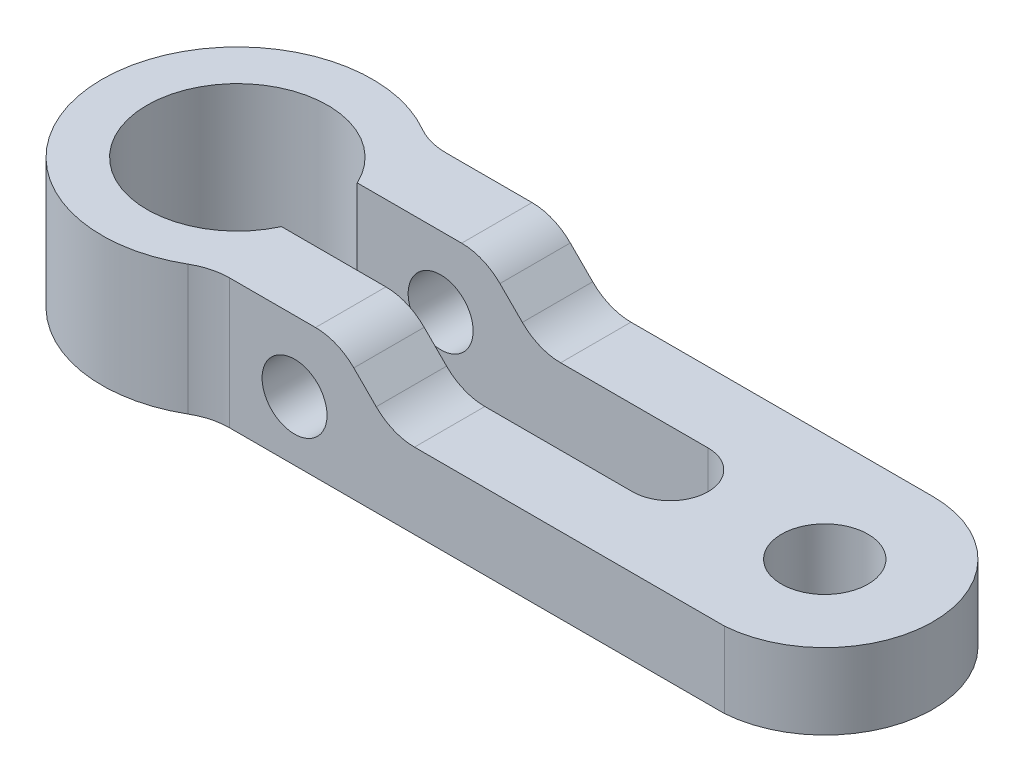
ISO-10303-21;
HEADER;
FILE_DESCRIPTION(('STEP AP214'),'2;1');
FILE_NAME('part.step','',(''),(''),'','','');
FILE_SCHEMA(('AUTOMOTIVE_DESIGN { 1 0 10303 214 1 1 1 1 }'));
ENDSEC;
DATA;
#1=APPLICATION_CONTEXT('core data for automotive mechanical design processes');
#2=APPLICATION_PROTOCOL_DEFINITION('international standard','automotive_design',2000,#1);
#3=PRODUCT_CONTEXT('',#1,'mechanical');
#4=PRODUCT('Part','Part','',(#3));
#5=PRODUCT_RELATED_PRODUCT_CATEGORY('part','',(#4));
#6=PRODUCT_DEFINITION_FORMATION('','',#4);
#7=PRODUCT_DEFINITION_CONTEXT('part definition',#1,'design');
#8=PRODUCT_DEFINITION('design','',#6,#7);
#9=PRODUCT_DEFINITION_SHAPE('','',#8);
#10=(LENGTH_UNIT() NAMED_UNIT(*) SI_UNIT(.MILLI.,.METRE.));
#11=(NAMED_UNIT(*) PLANE_ANGLE_UNIT() SI_UNIT($,.RADIAN.));
#12=(NAMED_UNIT(*) SI_UNIT($,.STERADIAN.) SOLID_ANGLE_UNIT());
#13=UNCERTAINTY_MEASURE_WITH_UNIT(LENGTH_MEASURE(1.E-05),#10,'distance_accuracy_value','');
#14=(GEOMETRIC_REPRESENTATION_CONTEXT(3) GLOBAL_UNCERTAINTY_ASSIGNED_CONTEXT((#13)) GLOBAL_UNIT_ASSIGNED_CONTEXT((#10,
#11,#12)) REPRESENTATION_CONTEXT('',''));
#15=CARTESIAN_POINT('',(0.,0.,0.));
#16=DIRECTION('',(0.,0.,1.));
#17=DIRECTION('',(1.,0.,0.));
#18=AXIS2_PLACEMENT_3D('',#15,#16,#17);
#19=CARTESIAN_POINT('',(19.2997939052517,12.,-12.5));
#20=DIRECTION('',(-0.707106781186543,-0.707106781186552,0.));
#21=DIRECTION('',(0.707106781186552,-0.707106781186543,0.));
#22=AXIS2_PLACEMENT_3D('',#19,#20,#21);
#23=PLANE('',#22);
#24=DIRECTION('',(0.,0.,1.));
#25=VECTOR('',#24,1.);
#26=CARTESIAN_POINT('',(20.7642599993189,10.5355339059328,-12.5));
#27=LINE('',#26,#25);
#28=CARTESIAN_POINT('',(20.7642599993189,10.5355339059328,-10.));
#29=VERTEX_POINT('',#28);
#30=CARTESIAN_POINT('',(20.7642599993189,10.5355339059328,-3.5));
#31=VERTEX_POINT('',#30);
#32=EDGE_CURVE('E353',#29,#31,#27,.T.);
#33=ORIENTED_EDGE('',*,*,#32,.T.);
#34=DIRECTION('',(0.707106781186552,-0.707106781186543,0.));
#35=VECTOR('',#34,1.);
#36=CARTESIAN_POINT('',(19.2997939052517,12.,-3.5));
#37=LINE('',#36,#35);
#38=CARTESIAN_POINT('',(22.8353278111845,8.46446609406724,-3.5));
#39=VERTEX_POINT('',#38);
#40=EDGE_CURVE('E225',#31,#39,#37,.T.);
#41=ORIENTED_EDGE('',*,*,#40,.T.);
#42=DIRECTION('',(0.,0.,1.));
#43=VECTOR('',#42,1.);
#44=CARTESIAN_POINT('',(22.8353278111845,8.46446609406724,-10.));
#45=LINE('',#44,#43);
#46=CARTESIAN_POINT('',(22.8353278111845,8.46446609406724,-10.));
#47=VERTEX_POINT('',#46);
#48=EDGE_CURVE('E357',#39,#47,#45,.F.);
#49=ORIENTED_EDGE('',*,*,#48,.T.);
#50=DIRECTION('',(0.707106781186552,-0.707106781186543,0.));
#51=VECTOR('',#50,1.);
#52=CARTESIAN_POINT('',(14.2934408578774,17.0063530473742,-10.));
#53=LINE('',#52,#51);
#54=EDGE_CURVE('E337',#29,#47,#53,.T.);
#55=ORIENTED_EDGE('',*,*,#54,.F.);
#56=EDGE_LOOP('',(#33,#41,#49,#55));
#57=FACE_BOUND('',#56,.T.);
#58=ADVANCED_FACE('F41',(#57),#23,.F.);
#59=CARTESIAN_POINT('',(15.2870878105033,5.5,-12.5));
#60=DIRECTION('',(0.,0.,1.));
#61=DIRECTION('',(1.,0.,0.));
#62=AXIS2_PLACEMENT_3D('',#59,#60,#61);
#63=CYLINDRICAL_SURFACE('',#62,3.);
#64=CARTESIAN_POINT('',(15.2870878105033,5.5,-3.5));
#65=DIRECTION('',(0.,0.,-1.));
#66=DIRECTION('',(-1.,0.,0.));
#67=AXIS2_PLACEMENT_3D('',#64,#65,#66);
#68=CIRCLE('',#67,3.);
#69=CARTESIAN_POINT('',(18.2870878105033,5.5,-3.5));
#70=VERTEX_POINT('',#69);
#71=EDGE_CURVE('E243',#70,#70,#68,.F.);
#72=CARTESIAN_POINT('',(15.2870878105033,5.5,-10.));
#73=DIRECTION('',(0.,0.,1.));
#74=DIRECTION('',(1.,0.,0.));
#75=AXIS2_PLACEMENT_3D('',#72,#73,#74);
#76=CIRCLE('',#75,3.);
#77=CARTESIAN_POINT('',(18.2870878105033,5.5,-10.));
#78=VERTEX_POINT('',#77);
#79=EDGE_CURVE('E251',#78,#78,#76,.T.);
#80=CARTESIAN_POINT('',(18.2870878105033,5.5,-3.5));
#81=CARTESIAN_POINT('',(18.2870878105033,5.5,-3.56770833333333));
#82=CARTESIAN_POINT('',(18.2870878105033,5.5,-3.63541666666666));
#83=CARTESIAN_POINT('',(18.2870878105033,5.5,-3.77083333333333));
#84=CARTESIAN_POINT('',(18.2870878105033,5.5,-3.83854166666667));
#85=CARTESIAN_POINT('',(18.2870878105033,5.5,-3.97395833333333));
#86=CARTESIAN_POINT('',(18.2870878105033,5.5,-4.04166666666667));
#87=CARTESIAN_POINT('',(18.2870878105033,5.5,-4.17708333333333));
#88=CARTESIAN_POINT('',(18.2870878105033,5.5,-4.24479166666667));
#89=CARTESIAN_POINT('',(18.2870878105033,5.5,-4.38020833333333));
#90=CARTESIAN_POINT('',(18.2870878105033,5.5,-4.44791666666667));
#91=CARTESIAN_POINT('',(18.2870878105033,5.5,-4.58333333333333));
#92=CARTESIAN_POINT('',(18.2870878105033,5.5,-4.65104166666667));
#93=CARTESIAN_POINT('',(18.2870878105033,5.5,-4.78645833333333));
#94=CARTESIAN_POINT('',(18.2870878105033,5.5,-4.85416666666666));
#95=CARTESIAN_POINT('',(18.2870878105033,5.5,-4.98958333333333));
#96=CARTESIAN_POINT('',(18.2870878105033,5.5,-5.05729166666667));
#97=CARTESIAN_POINT('',(18.2870878105033,5.5,-5.19270833333333));
#98=CARTESIAN_POINT('',(18.2870878105033,5.5,-5.26041666666667));
#99=CARTESIAN_POINT('',(18.2870878105033,5.5,-5.39583333333333));
#100=CARTESIAN_POINT('',(18.2870878105033,5.5,-5.46354166666667));
#101=CARTESIAN_POINT('',(18.2870878105033,5.5,-5.59895833333333));
#102=CARTESIAN_POINT('',(18.2870878105033,5.5,-5.66666666666667));
#103=CARTESIAN_POINT('',(18.2870878105033,5.5,-5.80208333333333));
#104=CARTESIAN_POINT('',(18.2870878105033,5.5,-5.86979166666667));
#105=CARTESIAN_POINT('',(18.2870878105033,5.5,-6.00520833333333));
#106=CARTESIAN_POINT('',(18.2870878105033,5.5,-6.07291666666667));
#107=CARTESIAN_POINT('',(18.2870878105033,5.5,-6.20833333333333));
#108=CARTESIAN_POINT('',(18.2870878105033,5.5,-6.27604166666667));
#109=CARTESIAN_POINT('',(18.2870878105033,5.5,-6.41145833333333));
#110=CARTESIAN_POINT('',(18.2870878105033,5.5,-6.47916666666667));
#111=CARTESIAN_POINT('',(18.2870878105033,5.5,-6.61458333333333));
#112=CARTESIAN_POINT('',(18.2870878105033,5.5,-6.68229166666667));
#113=CARTESIAN_POINT('',(18.2870878105033,5.5,-6.81770833333333));
#114=CARTESIAN_POINT('',(18.2870878105033,5.5,-6.88541666666667));
#115=CARTESIAN_POINT('',(18.2870878105033,5.5,-7.02083333333333));
#116=CARTESIAN_POINT('',(18.2870878105033,5.5,-7.08854166666667));
#117=CARTESIAN_POINT('',(18.2870878105033,5.5,-7.22395833333333));
#118=CARTESIAN_POINT('',(18.2870878105033,5.5,-7.29166666666667));
#119=CARTESIAN_POINT('',(18.2870878105033,5.5,-7.42708333333333));
#120=CARTESIAN_POINT('',(18.2870878105033,5.5,-7.49479166666667));
#121=CARTESIAN_POINT('',(18.2870878105033,5.5,-7.63020833333333));
#122=CARTESIAN_POINT('',(18.2870878105033,5.5,-7.69791666666667));
#123=CARTESIAN_POINT('',(18.2870878105033,5.5,-7.83333333333333));
#124=CARTESIAN_POINT('',(18.2870878105033,5.5,-7.90104166666667));
#125=CARTESIAN_POINT('',(18.2870878105033,5.5,-8.03645833333333));
#126=CARTESIAN_POINT('',(18.2870878105033,5.5,-8.10416666666667));
#127=CARTESIAN_POINT('',(18.2870878105033,5.5,-8.23958333333334));
#128=CARTESIAN_POINT('',(18.2870878105033,5.5,-8.30729166666667));
#129=CARTESIAN_POINT('',(18.2870878105033,5.5,-8.44270833333334));
#130=CARTESIAN_POINT('',(18.2870878105033,5.5,-8.51041666666667));
#131=CARTESIAN_POINT('',(18.2870878105033,5.5,-8.64583333333334));
#132=CARTESIAN_POINT('',(18.2870878105033,5.5,-8.71354166666667));
#133=CARTESIAN_POINT('',(18.2870878105033,5.5,-8.84895833333334));
#134=CARTESIAN_POINT('',(18.2870878105033,5.5,-8.91666666666667));
#135=CARTESIAN_POINT('',(18.2870878105033,5.5,-9.05208333333334));
#136=CARTESIAN_POINT('',(18.2870878105033,5.5,-9.11979166666667));
#137=CARTESIAN_POINT('',(18.2870878105033,5.5,-9.25520833333334));
#138=CARTESIAN_POINT('',(18.2870878105033,5.5,-9.32291666666667));
#139=CARTESIAN_POINT('',(18.2870878105033,5.5,-9.45833333333334));
#140=CARTESIAN_POINT('',(18.2870878105033,5.5,-9.52604166666667));
#141=CARTESIAN_POINT('',(18.2870878105033,5.5,-9.66145833333334));
#142=CARTESIAN_POINT('',(18.2870878105033,5.5,-9.72916666666667));
#143=CARTESIAN_POINT('',(18.2870878105033,5.5,-9.86458333333334));
#144=CARTESIAN_POINT('',(18.2870878105033,5.5,-9.93229166666667));
#145=CARTESIAN_POINT('',(18.2870878105033,5.5,-10.));
#146=B_SPLINE_CURVE_WITH_KNOTS('',3,(#80,#81,#82,#83,#84,#85,#86,#87,#88,#89,#90,#91,#92,#93,
#94,#95,#96,#97,#98,#99,#100,#101,#102,#103,#104,#105,#106,#107,#108,#109,#110,#111,#112,#113,
#114,#115,#116,#117,#118,#119,#120,#121,#122,#123,#124,#125,#126,#127,#128,#129,#130,#131,#132,
#133,#134,#135,#136,#137,#138,#139,#140,#141,#142,#143,#144,#145),.UNSPECIFIED.,.F.,.F.,(4,2,2,
2,2,2,2,2,2,2,2,2,2,2,2,2,2,2,2,2,2,2,2,2,2,2,2,2,2,2,2,2,4),(0.,0.203125,0.40625,
0.609375000000001,0.812500000000001,1.015625,1.21875,1.421875,1.625,1.828125,2.03125,2.234375,
2.4375,2.640625,2.84375,3.046875,3.25,3.453125,3.65625,3.859375,4.0625,4.265625,4.46875,
4.671875,4.87500000000001,5.078125,5.28125,5.484375,5.68750000000001,5.89062500000001,
6.09375000000001,6.29687500000001,6.50000000000001),.UNSPECIFIED.);
#147=EDGE_CURVE('BSEAM514',#70,#78,#146,.T.);
#148=ORIENTED_EDGE('',*,*,#71,.T.);
#149=ORIENTED_EDGE('',*,*,#79,.F.);
#150=ORIENTED_EDGE('',*,*,#147,.T.);
#151=ORIENTED_EDGE('',*,*,#147,.F.);
#152=EDGE_LOOP('',(#148,#150,#149,#151));
#153=FACE_BOUND('',#152,.T.);
#154=ADVANCED_FACE('F514',(#153),#63,.F.);
#155=CARTESIAN_POINT('',(26.3708617171172,12.,-12.5));
#156=DIRECTION('',(0.,0.,-1.));
#157=DIRECTION('',(-1.,0.,0.));
#158=AXIS2_PLACEMENT_3D('',#155,#156,#157);
#159=CYLINDRICAL_SURFACE('',#158,5.);
#160=ORIENTED_EDGE('',*,*,#48,.F.);
#161=CARTESIAN_POINT('',(26.3708617171172,12.,-3.5));
#162=DIRECTION('',(0.,0.,-1.));
#163=DIRECTION('',(-1.,0.,0.));
#164=AXIS2_PLACEMENT_3D('',#161,#162,#163);
#165=CIRCLE('',#164,5.);
#166=CARTESIAN_POINT('',(26.3708617171172,7.,-3.5));
#167=VERTEX_POINT('',#166);
#168=EDGE_CURVE('E232',#39,#167,#165,.F.);
#169=ORIENTED_EDGE('',*,*,#168,.T.);
#170=DIRECTION('',(0.,0.,1.));
#171=VECTOR('',#170,1.);
#172=CARTESIAN_POINT('',(26.3708617171172,7.,10.));
#173=LINE('',#172,#171);
#174=CARTESIAN_POINT('',(26.3708617171172,7.,-10.));
#175=VERTEX_POINT('',#174);
#176=EDGE_CURVE('E348',#175,#167,#173,.T.);
#177=ORIENTED_EDGE('',*,*,#176,.F.);
#178=CARTESIAN_POINT('',(26.3708617171172,12.,-10.));
#179=DIRECTION('',(0.,0.,1.));
#180=DIRECTION('',(1.,0.,0.));
#181=AXIS2_PLACEMENT_3D('',#178,#179,#180);
#182=CIRCLE('',#181,5.);
#183=EDGE_CURVE('E375',#47,#175,#182,.T.);
#184=ORIENTED_EDGE('',*,*,#183,.F.);
#185=EDGE_LOOP('',(#160,#169,#177,#184));
#186=FACE_BOUND('',#185,.T.);
#187=ADVANCED_FACE('F475',(#186),#159,.F.);
#188=CARTESIAN_POINT('',(17.2287260933862,7.,-12.5));
#189=DIRECTION('',(0.,0.,1.));
#190=DIRECTION('',(1.,0.,0.));
#191=AXIS2_PLACEMENT_3D('',#188,#189,#190);
#192=CYLINDRICAL_SURFACE('',#191,5.);
#193=CARTESIAN_POINT('',(17.2287260933862,7.,-3.5));
#194=DIRECTION('',(0.,0.,-1.));
#195=DIRECTION('',(-1.,0.,0.));
#196=AXIS2_PLACEMENT_3D('',#193,#194,#195);
#197=CIRCLE('',#196,5.);
#198=CARTESIAN_POINT('',(17.2287260933862,12.,-3.5));
#199=VERTEX_POINT('',#198);
#200=EDGE_CURVE('E50',#31,#199,#197,.F.);
#201=ORIENTED_EDGE('',*,*,#200,.F.);
#202=ORIENTED_EDGE('',*,*,#32,.F.);
#203=CARTESIAN_POINT('',(17.2287260933862,7.,-10.));
#204=DIRECTION('',(0.,0.,1.));
#205=DIRECTION('',(1.,0.,0.));
#206=AXIS2_PLACEMENT_3D('',#203,#204,#205);
#207=CIRCLE('',#206,5.);
#208=CARTESIAN_POINT('',(17.2287260933862,12.,-10.));
#209=VERTEX_POINT('',#208);
#210=EDGE_CURVE('E369',#209,#29,#207,.F.);
#211=ORIENTED_EDGE('',*,*,#210,.F.);
#212=DIRECTION('',(0.,0.,1.));
#213=VECTOR('',#212,1.);
#214=CARTESIAN_POINT('',(17.2287260933862,12.,-16.));
#215=LINE('',#214,#213);
#216=EDGE_CURVE('E65',#199,#209,#215,.F.);
#217=ORIENTED_EDGE('',*,*,#216,.F.);
#218=EDGE_LOOP('',(#201,#202,#211,#217));
#219=FACE_BOUND('',#218,.T.);
#220=ADVANCED_FACE('F392',(#219),#192,.T.);
#221=CARTESIAN_POINT('',(9.28708781050334,12.,-16.));
#222=DIRECTION('',(0.,-1.,0.));
#223=DIRECTION('',(0.,0.,-1.));
#224=AXIS2_PLACEMENT_3D('',#221,#222,#223);
#225=PLANE('',#224);
#226=CARTESIAN_POINT('',(0.,12.,0.));
#227=DIRECTION('',(0.,1.,0.));
#228=DIRECTION('',(0.,0.,1.));
#229=AXIS2_PLACEMENT_3D('',#226,#227,#228);
#230=CIRCLE('',#229,8.35);
#231=CARTESIAN_POINT('',(7.58106193089069,12.,-3.5));
#232=VERTEX_POINT('',#231);
#233=CARTESIAN_POINT('',(7.58106193089069,12.,3.5));
#234=VERTEX_POINT('',#233);
#235=EDGE_CURVE('E271',#232,#234,#230,.T.);
#236=ORIENTED_EDGE('',*,*,#235,.F.);
#237=DIRECTION('',(1.,0.,0.));
#238=VECTOR('',#237,1.);
#239=CARTESIAN_POINT('',(9.28708781050334,12.,-3.5));
#240=LINE('',#239,#238);
#241=EDGE_CURVE('E229',#232,#199,#240,.T.);
#242=ORIENTED_EDGE('',*,*,#241,.T.);
#243=ORIENTED_EDGE('',*,*,#216,.T.);
#244=DIRECTION('',(-1.,0.,0.));
#245=VECTOR('',#244,1.);
#246=CARTESIAN_POINT('',(9.28708781050334,12.,-10.));
#247=LINE('',#246,#245);
#248=CARTESIAN_POINT('',(9.28708781050334,12.,-10.));
#249=VERTEX_POINT('',#248);
#250=EDGE_CURVE('E293',#209,#249,#247,.T.);
#251=ORIENTED_EDGE('',*,*,#250,.T.);
#252=CARTESIAN_POINT('',(9.28708781050334,12.,-16.));
#253=DIRECTION('',(0.,-1.,0.));
#254=DIRECTION('',(0.,0.,-1.));
#255=AXIS2_PLACEMENT_3D('',#252,#253,#254);
#256=CIRCLE('',#255,6.);
#257=CARTESIAN_POINT('',(6.27505933142117,12.,-10.8108108108108));
#258=VERTEX_POINT('',#257);
#259=EDGE_CURVE('E278',#249,#258,#256,.T.);
#260=ORIENTED_EDGE('',*,*,#259,.T.);
#261=CARTESIAN_POINT('',(0.,12.,0.));
#262=DIRECTION('',(0.,1.,0.));
#263=DIRECTION('',(0.,0.,1.));
#264=AXIS2_PLACEMENT_3D('',#261,#262,#263);
#265=CIRCLE('',#264,12.5);
#266=CARTESIAN_POINT('',(6.27505933142117,12.,10.8108108108108));
#267=VERTEX_POINT('',#266);
#268=EDGE_CURVE('E282',#258,#267,#265,.T.);
#269=ORIENTED_EDGE('',*,*,#268,.T.);
#270=CARTESIAN_POINT('',(9.28708781050334,12.,16.));
#271=DIRECTION('',(0.,-1.,0.));
#272=DIRECTION('',(0.,0.,1.));
#273=AXIS2_PLACEMENT_3D('',#270,#271,#272);
#274=CIRCLE('',#273,6.);
#275=CARTESIAN_POINT('',(9.28708781050334,12.,10.));
#276=VERTEX_POINT('',#275);
#277=EDGE_CURVE('E286',#267,#276,#274,.T.);
#278=ORIENTED_EDGE('',*,*,#277,.T.);
#279=DIRECTION('',(1.,0.,0.));
#280=VECTOR('',#279,1.);
#281=CARTESIAN_POINT('',(54.9999999999998,12.,10.));
#282=LINE('',#281,#280);
#283=CARTESIAN_POINT('',(17.2287260933862,12.,10.));
#284=VERTEX_POINT('',#283);
#285=EDGE_CURVE('E289',#276,#284,#282,.T.);
#286=ORIENTED_EDGE('',*,*,#285,.T.);
#287=CARTESIAN_POINT('',(17.2287260933862,12.,3.5));
#288=VERTEX_POINT('',#287);
#289=EDGE_CURVE('E365',#284,#288,#215,.F.);
#290=ORIENTED_EDGE('',*,*,#289,.T.);
#291=DIRECTION('',(-1.,0.,0.));
#292=VECTOR('',#291,1.);
#293=CARTESIAN_POINT('',(9.28708781050334,12.,3.5));
#294=LINE('',#293,#292);
#295=EDGE_CURVE('E57',#288,#234,#294,.T.);
#296=ORIENTED_EDGE('',*,*,#295,.T.);
#297=EDGE_LOOP('',(#236,#242,#243,#251,#260,#269,#278,#286,#290,#296));
#298=FACE_BOUND('',#297,.T.);
#299=ADVANCED_FACE('F390',(#298),#225,.F.);
#300=CARTESIAN_POINT('',(9.28708781050334,0.,-16.));
#301=DIRECTION('',(0.,-1.,0.));
#302=DIRECTION('',(0.,0.,-1.));
#303=AXIS2_PLACEMENT_3D('',#300,#301,#302);
#304=PLANE('',#303);
#305=DIRECTION('',(-1.,0.,0.));
#306=VECTOR('',#305,1.);
#307=CARTESIAN_POINT('',(0.,0.,-3.5));
#308=LINE('',#307,#306);
#309=CARTESIAN_POINT('',(40.,0.,-3.5));
#310=VERTEX_POINT('',#309);
#311=CARTESIAN_POINT('',(7.58106193089069,0.,-3.5));
#312=VERTEX_POINT('',#311);
#313=EDGE_CURVE('E178',#310,#312,#308,.T.);
#314=ORIENTED_EDGE('',*,*,#313,.T.);
#315=CARTESIAN_POINT('',(0.,0.,0.));
#316=DIRECTION('',(0.,1.,0.));
#317=DIRECTION('',(0.,0.,1.));
#318=AXIS2_PLACEMENT_3D('',#315,#316,#317);
#319=CIRCLE('',#318,8.35);
#320=CARTESIAN_POINT('',(7.58106193089069,0.,3.5));
#321=VERTEX_POINT('',#320);
#322=EDGE_CURVE('E193',#312,#321,#319,.T.);
#323=ORIENTED_EDGE('',*,*,#322,.T.);
#324=DIRECTION('',(1.,0.,0.));
#325=VECTOR('',#324,1.);
#326=CARTESIAN_POINT('',(0.,0.,3.5));
#327=LINE('',#326,#325);
#328=CARTESIAN_POINT('',(40.,0.,3.5));
#329=VERTEX_POINT('',#328);
#330=EDGE_CURVE('E171',#321,#329,#327,.T.);
#331=ORIENTED_EDGE('',*,*,#330,.T.);
#332=CARTESIAN_POINT('',(40.,0.,0.));
#333=DIRECTION('',(0.,1.,0.));
#334=DIRECTION('',(0.,0.,-1.));
#335=AXIS2_PLACEMENT_3D('',#332,#333,#334);
#336=CIRCLE('',#335,3.5);
#337=EDGE_CURVE('E181',#329,#310,#336,.T.);
#338=ORIENTED_EDGE('',*,*,#337,.T.);
#339=EDGE_LOOP('',(#314,#323,#331,#338));
#340=FACE_BOUND('',#339,.T.);
#341=CARTESIAN_POINT('',(9.28708781050334,0.,-16.));
#342=DIRECTION('',(0.,-1.,0.));
#343=DIRECTION('',(0.,0.,-1.));
#344=AXIS2_PLACEMENT_3D('',#341,#342,#343);
#345=CIRCLE('',#344,6.);
#346=CARTESIAN_POINT('',(9.28708781050334,0.,-10.));
#347=VERTEX_POINT('',#346);
#348=CARTESIAN_POINT('',(6.27505933142117,0.,-10.8108108108108));
#349=VERTEX_POINT('',#348);
#350=EDGE_CURVE('E275',#347,#349,#345,.T.);
#351=ORIENTED_EDGE('',*,*,#350,.F.);
#352=DIRECTION('',(-1.,0.,0.));
#353=VECTOR('',#352,1.);
#354=CARTESIAN_POINT('',(9.28708781050334,0.,-10.));
#355=LINE('',#354,#353);
#356=CARTESIAN_POINT('',(54.2870878105034,0.,-10.));
#357=VERTEX_POINT('',#356);
#358=EDGE_CURVE('E283',#357,#347,#355,.T.);
#359=ORIENTED_EDGE('',*,*,#358,.F.);
#360=CARTESIAN_POINT('',(54.2870878105034,0.,0.0127060947483163));
#361=DIRECTION('',(0.,1.,0.));
#362=DIRECTION('',(0.,0.,-1.));
#363=AXIS2_PLACEMENT_3D('',#360,#361,#362);
#364=CIRCLE('',#363,10.0127060947483);
#365=CARTESIAN_POINT('',(54.9999999999998,0.,10.));
#366=VERTEX_POINT('',#365);
#367=EDGE_CURVE('E310',#366,#357,#364,.T.);
#368=ORIENTED_EDGE('',*,*,#367,.F.);
#369=DIRECTION('',(1.,0.,0.));
#370=VECTOR('',#369,1.);
#371=CARTESIAN_POINT('',(54.9999999999998,0.,10.));
#372=LINE('',#371,#370);
#373=CARTESIAN_POINT('',(9.28708781050334,0.,10.));
#374=VERTEX_POINT('',#373);
#375=EDGE_CURVE('E306',#374,#366,#372,.T.);
#376=ORIENTED_EDGE('',*,*,#375,.F.);
#377=CARTESIAN_POINT('',(9.28708781050334,0.,16.));
#378=DIRECTION('',(0.,-1.,0.));
#379=DIRECTION('',(0.,0.,1.));
#380=AXIS2_PLACEMENT_3D('',#377,#378,#379);
#381=CIRCLE('',#380,6.);
#382=CARTESIAN_POINT('',(6.27505933142117,0.,10.8108108108108));
#383=VERTEX_POINT('',#382);
#384=EDGE_CURVE('E303',#383,#374,#381,.T.);
#385=ORIENTED_EDGE('',*,*,#384,.F.);
#386=CARTESIAN_POINT('',(0.,0.,0.));
#387=DIRECTION('',(0.,1.,0.));
#388=DIRECTION('',(0.,0.,1.));
#389=AXIS2_PLACEMENT_3D('',#386,#387,#388);
#390=CIRCLE('',#389,12.5);
#391=EDGE_CURVE('E300',#349,#383,#390,.T.);
#392=ORIENTED_EDGE('',*,*,#391,.F.);
#393=EDGE_LOOP('',(#351,#359,#368,#376,#385,#392));
#394=FACE_BOUND('',#393,.T.);
#395=CARTESIAN_POINT('',(54.2870878105034,0.,0.0127060947483163));
#396=DIRECTION('',(0.,1.,0.));
#397=DIRECTION('',(0.,0.,1.));
#398=AXIS2_PLACEMENT_3D('',#395,#396,#397);
#399=CIRCLE('',#398,4.00000000000001);
#400=CARTESIAN_POINT('',(54.2870878105034,0.,4.01270609474832));
#401=VERTEX_POINT('',#400);
#402=EDGE_CURVE('E267',#401,#401,#399,.T.);
#403=ORIENTED_EDGE('',*,*,#402,.T.);
#404=EDGE_LOOP('',(#403));
#405=FACE_BOUND('',#404,.T.);
#406=ADVANCED_FACE('F190',(#340,#394,#405),#304,.T.);
#407=CARTESIAN_POINT('',(9.28708781050334,12.,-16.));
#408=DIRECTION('',(0.,-1.,0.));
#409=DIRECTION('',(0.,0.,-1.));
#410=AXIS2_PLACEMENT_3D('',#407,#408,#409);
#411=CYLINDRICAL_SURFACE('',#410,6.);
#412=ORIENTED_EDGE('',*,*,#350,.T.);
#413=DIRECTION('',(0.,-1.,0.));
#414=VECTOR('',#413,1.);
#415=CARTESIAN_POINT('',(6.27505933142117,12.,-10.8108108108108));
#416=LINE('',#415,#414);
#417=EDGE_CURVE('E333',#258,#349,#416,.T.);
#418=ORIENTED_EDGE('',*,*,#417,.F.);
#419=ORIENTED_EDGE('',*,*,#259,.F.);
#420=DIRECTION('',(0.,-1.,0.));
#421=VECTOR('',#420,1.);
#422=CARTESIAN_POINT('',(9.28708781050334,12.,-10.));
#423=LINE('',#422,#421);
#424=EDGE_CURVE('E296',#249,#347,#423,.T.);
#425=ORIENTED_EDGE('',*,*,#424,.T.);
#426=EDGE_LOOP('',(#412,#418,#419,#425));
#427=FACE_BOUND('',#426,.T.);
#428=ADVANCED_FACE('F484',(#427),#411,.F.);
#429=CARTESIAN_POINT('',(0.,12.,0.));
#430=DIRECTION('',(0.,-1.,0.));
#431=DIRECTION('',(0.,0.,-1.));
#432=AXIS2_PLACEMENT_3D('',#429,#430,#431);
#433=CYLINDRICAL_SURFACE('',#432,12.5);
#434=ORIENTED_EDGE('',*,*,#391,.T.);
#435=DIRECTION('',(0.,-1.,0.));
#436=VECTOR('',#435,1.);
#437=CARTESIAN_POINT('',(6.27505933142117,12.,10.8108108108108));
#438=LINE('',#437,#436);
#439=EDGE_CURVE('E329',#267,#383,#438,.T.);
#440=ORIENTED_EDGE('',*,*,#439,.F.);
#441=ORIENTED_EDGE('',*,*,#268,.F.);
#442=ORIENTED_EDGE('',*,*,#417,.T.);
#443=EDGE_LOOP('',(#434,#440,#441,#442));
#444=FACE_BOUND('',#443,.T.);
#445=ADVANCED_FACE('F487',(#444),#433,.T.);
#446=CARTESIAN_POINT('',(9.28708781050334,12.,16.));
#447=DIRECTION('',(0.,-1.,0.));
#448=DIRECTION('',(0.,0.,-1.));
#449=AXIS2_PLACEMENT_3D('',#446,#447,#448);
#450=CYLINDRICAL_SURFACE('',#449,6.);
#451=ORIENTED_EDGE('',*,*,#384,.T.);
#452=DIRECTION('',(0.,-1.,0.));
#453=VECTOR('',#452,1.);
#454=CARTESIAN_POINT('',(9.28708781050334,12.,10.));
#455=LINE('',#454,#453);
#456=EDGE_CURVE('E325',#276,#374,#455,.T.);
#457=ORIENTED_EDGE('',*,*,#456,.F.);
#458=ORIENTED_EDGE('',*,*,#277,.F.);
#459=ORIENTED_EDGE('',*,*,#439,.T.);
#460=EDGE_LOOP('',(#451,#457,#458,#459));
#461=FACE_BOUND('',#460,.T.);
#462=ADVANCED_FACE('F492',(#461),#450,.F.);
#463=CARTESIAN_POINT('',(54.9999999999998,12.,10.));
#464=DIRECTION('',(0.,0.,-1.));
#465=DIRECTION('',(-1.,0.,0.));
#466=AXIS2_PLACEMENT_3D('',#463,#464,#465);
#467=PLANE('',#466);
#468=CARTESIAN_POINT('',(15.2870878105033,5.5,10.));
#469=DIRECTION('',(0.,0.,1.));
#470=DIRECTION('',(1.,0.,0.));
#471=AXIS2_PLACEMENT_3D('',#468,#469,#470);
#472=CIRCLE('',#471,3.);
#473=CARTESIAN_POINT('',(18.2870878105033,5.5,10.));
#474=VERTEX_POINT('',#473);
#475=EDGE_CURVE('E247',#474,#474,#472,.T.);
#476=ORIENTED_EDGE('',*,*,#475,.F.);
#477=EDGE_LOOP('',(#476));
#478=FACE_BOUND('',#477,.T.);
#479=DIRECTION('',(0.707106781186552,-0.707106781186543,0.));
#480=VECTOR('',#479,1.);
#481=CARTESIAN_POINT('',(19.2997939052517,12.,10.));
#482=LINE('',#481,#480);
#483=CARTESIAN_POINT('',(20.7642599993189,10.5355339059328,10.));
#484=VERTEX_POINT('',#483);
#485=CARTESIAN_POINT('',(22.8353278111845,8.46446609406725,10.));
#486=VERTEX_POINT('',#485);
#487=EDGE_CURVE('E252',#484,#486,#482,.T.);
#488=ORIENTED_EDGE('',*,*,#487,.F.);
#489=CARTESIAN_POINT('',(17.2287260933862,7.,10.));
#490=DIRECTION('',(0.,0.,-1.));
#491=DIRECTION('',(-1.,0.,0.));
#492=AXIS2_PLACEMENT_3D('',#489,#490,#491);
#493=CIRCLE('',#492,5.);
#494=EDGE_CURVE('E362',#484,#284,#493,.F.);
#495=ORIENTED_EDGE('',*,*,#494,.T.);
#496=ORIENTED_EDGE('',*,*,#285,.F.);
#497=ORIENTED_EDGE('',*,*,#456,.T.);
#498=ORIENTED_EDGE('',*,*,#375,.T.);
#499=DIRECTION('',(0.,-1.,0.));
#500=VECTOR('',#499,1.);
#501=CARTESIAN_POINT('',(54.9999999999998,12.,10.));
#502=LINE('',#501,#500);
#503=CARTESIAN_POINT('',(54.9999999999998,7.,10.));
#504=VERTEX_POINT('',#503);
#505=EDGE_CURVE('E322',#504,#366,#502,.T.);
#506=ORIENTED_EDGE('',*,*,#505,.F.);
#507=DIRECTION('',(1.,0.,0.));
#508=VECTOR('',#507,1.);
#509=CARTESIAN_POINT('',(24.2997939052517,7.,10.));
#510=LINE('',#509,#508);
#511=CARTESIAN_POINT('',(26.3708617171172,7.,10.));
#512=VERTEX_POINT('',#511);
#513=EDGE_CURVE('E256',#512,#504,#510,.T.);
#514=ORIENTED_EDGE('',*,*,#513,.F.);
#515=CARTESIAN_POINT('',(26.3708617171172,12.,10.));
#516=DIRECTION('',(0.,0.,-1.));
#517=DIRECTION('',(-1.,0.,0.));
#518=AXIS2_PLACEMENT_3D('',#515,#516,#517);
#519=CIRCLE('',#518,5.);
#520=EDGE_CURVE('E372',#512,#486,#519,.T.);
#521=ORIENTED_EDGE('',*,*,#520,.T.);
#522=EDGE_LOOP('',(#488,#495,#496,#497,#498,#506,#514,#521));
#523=FACE_BOUND('',#522,.T.);
#524=ADVANCED_FACE('F462',(#478,#523),#467,.F.);
#525=CARTESIAN_POINT('',(54.2870878105034,12.,0.0127060947483163));
#526=DIRECTION('',(0.,-1.,0.));
#527=DIRECTION('',(0.,0.,-1.));
#528=AXIS2_PLACEMENT_3D('',#525,#526,#527);
#529=CYLINDRICAL_SURFACE('',#528,10.0127060947483);
#530=CARTESIAN_POINT('',(54.2870878105034,7.,0.0127060947483163));
#531=DIRECTION('',(0.,-1.,0.));
#532=DIRECTION('',(0.,0.,-1.));
#533=AXIS2_PLACEMENT_3D('',#530,#531,#532);
#534=CIRCLE('',#533,10.0127060947483);
#535=CARTESIAN_POINT('',(54.2870878105034,7.,-10.));
#536=VERTEX_POINT('',#535);
#537=EDGE_CURVE('E263',#536,#504,#534,.T.);
#538=ORIENTED_EDGE('',*,*,#537,.T.);
#539=ORIENTED_EDGE('',*,*,#505,.T.);
#540=ORIENTED_EDGE('',*,*,#367,.T.);
#541=DIRECTION('',(0.,-1.,0.));
#542=VECTOR('',#541,1.);
#543=CARTESIAN_POINT('',(54.2870878105034,12.,-10.));
#544=LINE('',#543,#542);
#545=EDGE_CURVE('E319',#536,#357,#544,.T.);
#546=ORIENTED_EDGE('',*,*,#545,.F.);
#547=EDGE_LOOP('',(#538,#539,#540,#546));
#548=FACE_BOUND('',#547,.T.);
#549=ADVANCED_FACE('F466',(#548),#529,.T.);
#550=CARTESIAN_POINT('',(9.28708781050334,12.,-10.));
#551=DIRECTION('',(0.,0.,1.));
#552=DIRECTION('',(1.,0.,0.));
#553=AXIS2_PLACEMENT_3D('',#550,#551,#552);
#554=PLANE('',#553);
#555=ORIENTED_EDGE('',*,*,#79,.T.);
#556=EDGE_LOOP('',(#555));
#557=FACE_BOUND('',#556,.T.);
#558=ORIENTED_EDGE('',*,*,#250,.F.);
#559=ORIENTED_EDGE('',*,*,#210,.T.);
#560=ORIENTED_EDGE('',*,*,#54,.T.);
#561=ORIENTED_EDGE('',*,*,#183,.T.);
#562=DIRECTION('',(1.,0.,0.));
#563=VECTOR('',#562,1.);
#564=CARTESIAN_POINT('',(9.28708781050334,7.,-10.));
#565=LINE('',#564,#563);
#566=EDGE_CURVE('E260',#175,#536,#565,.T.);
#567=ORIENTED_EDGE('',*,*,#566,.T.);
#568=ORIENTED_EDGE('',*,*,#545,.T.);
#569=ORIENTED_EDGE('',*,*,#358,.T.);
#570=ORIENTED_EDGE('',*,*,#424,.F.);
#571=EDGE_LOOP('',(#558,#559,#560,#561,#567,#568,#569,#570));
#572=FACE_BOUND('',#571,.T.);
#573=ADVANCED_FACE('F478',(#557,#572),#554,.F.);
#574=CARTESIAN_POINT('',(0.,12.,0.));
#575=DIRECTION('',(0.,-1.,0.));
#576=DIRECTION('',(0.,0.,-1.));
#577=AXIS2_PLACEMENT_3D('',#574,#575,#576);
#578=CYLINDRICAL_SURFACE('',#577,8.35);
#579=DIRECTION('',(0.,-1.,0.));
#580=VECTOR('',#579,1.);
#581=CARTESIAN_POINT('',(7.58106193089069,12.,-3.5));
#582=LINE('',#581,#580);
#583=EDGE_CURVE('E240',#232,#312,#582,.T.);
#584=ORIENTED_EDGE('',*,*,#583,.F.);
#585=ORIENTED_EDGE('',*,*,#235,.T.);
#586=DIRECTION('',(0.,-1.,0.));
#587=VECTOR('',#586,1.);
#588=CARTESIAN_POINT('',(7.58106193089069,12.,3.5));
#589=LINE('',#588,#587);
#590=EDGE_CURVE('E218',#321,#234,#589,.F.);
#591=ORIENTED_EDGE('',*,*,#590,.F.);
#592=ORIENTED_EDGE('',*,*,#322,.F.);
#593=EDGE_LOOP('',(#584,#585,#591,#592));
#594=FACE_BOUND('',#593,.T.);
#595=ADVANCED_FACE('F510',(#594),#578,.F.);
#596=CARTESIAN_POINT('',(54.2870878105034,12.,0.0127060947483163));
#597=DIRECTION('',(0.,-1.,0.));
#598=DIRECTION('',(0.,0.,-1.));
#599=AXIS2_PLACEMENT_3D('',#596,#597,#598);
#600=CYLINDRICAL_SURFACE('',#599,4.00000000000001);
#601=CARTESIAN_POINT('',(54.2870878105034,7.,0.0127060947483163));
#602=DIRECTION('',(0.,-1.,0.));
#603=DIRECTION('',(0.,0.,-1.));
#604=AXIS2_PLACEMENT_3D('',#601,#602,#603);
#605=CIRCLE('',#604,4.00000000000001);
#606=CARTESIAN_POINT('',(54.2870878105034,7.,-3.98729390525169));
#607=VERTEX_POINT('',#606);
#608=EDGE_CURVE('E259',#607,#607,#605,.T.);
#609=ORIENTED_EDGE('',*,*,#608,.F.);
#610=EDGE_LOOP('',(#609));
#611=FACE_BOUND('',#610,.T.);
#612=ORIENTED_EDGE('',*,*,#402,.F.);
#613=EDGE_LOOP('',(#612));
#614=FACE_BOUND('',#613,.T.);
#615=ADVANCED_FACE('F501',(#611,#614),#600,.F.);
#616=CARTESIAN_POINT('',(22.8353278111845,8.46446609406724,3.5));
#617=VERTEX_POINT('',#616);
#618=EDGE_CURVE('E358',#486,#617,#45,.F.);
#619=ORIENTED_EDGE('',*,*,#618,.T.);
#620=DIRECTION('',(-0.707106781186552,0.707106781186543,0.));
#621=VECTOR('',#620,1.);
#622=CARTESIAN_POINT('',(19.2997939052517,12.,3.5));
#623=LINE('',#622,#621);
#624=CARTESIAN_POINT('',(20.7642599993189,10.5355339059328,3.5));
#625=VERTEX_POINT('',#624);
#626=EDGE_CURVE('E204',#617,#625,#623,.T.);
#627=ORIENTED_EDGE('',*,*,#626,.T.);
#628=EDGE_CURVE('E352',#625,#484,#27,.T.);
#629=ORIENTED_EDGE('',*,*,#628,.T.);
#630=ORIENTED_EDGE('',*,*,#487,.T.);
#631=EDGE_LOOP('',(#619,#627,#629,#630));
#632=FACE_BOUND('',#631,.T.);
#633=ADVANCED_FACE('F499',(#632),#23,.F.);
#634=CARTESIAN_POINT('',(24.2997939052517,7.,-12.5));
#635=DIRECTION('',(0.,-1.,0.));
#636=DIRECTION('',(0.,0.,-1.));
#637=AXIS2_PLACEMENT_3D('',#634,#635,#636);
#638=PLANE('',#637);
#639=ORIENTED_EDGE('',*,*,#608,.T.);
#640=EDGE_LOOP('',(#639));
#641=FACE_BOUND('',#640,.T.);
#642=ORIENTED_EDGE('',*,*,#176,.T.);
#643=DIRECTION('',(1.,0.,0.));
#644=VECTOR('',#643,1.);
#645=CARTESIAN_POINT('',(24.2997939052517,7.,-3.5));
#646=LINE('',#645,#644);
#647=CARTESIAN_POINT('',(40.,7.,-3.5));
#648=VERTEX_POINT('',#647);
#649=EDGE_CURVE('E236',#167,#648,#646,.T.);
#650=ORIENTED_EDGE('',*,*,#649,.T.);
#651=CARTESIAN_POINT('',(40.,7.,0.));
#652=DIRECTION('',(0.,-1.,0.));
#653=DIRECTION('',(0.,0.,-1.));
#654=AXIS2_PLACEMENT_3D('',#651,#652,#653);
#655=CIRCLE('',#654,3.5);
#656=CARTESIAN_POINT('',(40.,7.,3.5));
#657=VERTEX_POINT('',#656);
#658=EDGE_CURVE('E11',#648,#657,#655,.T.);
#659=ORIENTED_EDGE('',*,*,#658,.T.);
#660=DIRECTION('',(-1.,0.,0.));
#661=VECTOR('',#660,1.);
#662=CARTESIAN_POINT('',(24.2997939052517,7.,3.5));
#663=LINE('',#662,#661);
#664=CARTESIAN_POINT('',(26.3708617171172,7.,3.5));
#665=VERTEX_POINT('',#664);
#666=EDGE_CURVE('E174',#657,#665,#663,.T.);
#667=ORIENTED_EDGE('',*,*,#666,.T.);
#668=EDGE_CURVE('E344',#665,#512,#173,.T.);
#669=ORIENTED_EDGE('',*,*,#668,.T.);
#670=ORIENTED_EDGE('',*,*,#513,.T.);
#671=ORIENTED_EDGE('',*,*,#537,.F.);
#672=ORIENTED_EDGE('',*,*,#566,.F.);
#673=EDGE_LOOP('',(#642,#650,#659,#667,#669,#670,#671,#672));
#674=FACE_BOUND('',#673,.T.);
#675=ADVANCED_FACE('F453',(#641,#674),#638,.F.);
#676=CARTESIAN_POINT('',(15.2870878105033,5.5,3.5));
#677=DIRECTION('',(0.,0.,1.));
#678=DIRECTION('',(1.,0.,0.));
#679=AXIS2_PLACEMENT_3D('',#676,#677,#678);
#680=CIRCLE('',#679,3.);
#681=CARTESIAN_POINT('',(18.2870878105033,5.5,3.5));
#682=VERTEX_POINT('',#681);
#683=EDGE_CURVE('E221',#682,#682,#680,.F.);
#684=CARTESIAN_POINT('',(18.2870878105033,5.5,3.5));
#685=CARTESIAN_POINT('',(18.2870878105033,5.5,3.56770833333333));
#686=CARTESIAN_POINT('',(18.2870878105033,5.5,3.63541666666667));
#687=CARTESIAN_POINT('',(18.2870878105033,5.5,3.77083333333333));
#688=CARTESIAN_POINT('',(18.2870878105033,5.5,3.83854166666667));
#689=CARTESIAN_POINT('',(18.2870878105033,5.5,3.97395833333333));
#690=CARTESIAN_POINT('',(18.2870878105033,5.5,4.04166666666667));
#691=CARTESIAN_POINT('',(18.2870878105033,5.5,4.17708333333333));
#692=CARTESIAN_POINT('',(18.2870878105033,5.5,4.24479166666667));
#693=CARTESIAN_POINT('',(18.2870878105033,5.5,4.38020833333333));
#694=CARTESIAN_POINT('',(18.2870878105033,5.5,4.44791666666667));
#695=CARTESIAN_POINT('',(18.2870878105033,5.5,4.58333333333333));
#696=CARTESIAN_POINT('',(18.2870878105033,5.5,4.65104166666667));
#697=CARTESIAN_POINT('',(18.2870878105033,5.5,4.78645833333333));
#698=CARTESIAN_POINT('',(18.2870878105033,5.5,4.85416666666667));
#699=CARTESIAN_POINT('',(18.2870878105033,5.5,4.98958333333334));
#700=CARTESIAN_POINT('',(18.2870878105033,5.5,5.05729166666667));
#701=CARTESIAN_POINT('',(18.2870878105033,5.5,5.19270833333333));
#702=CARTESIAN_POINT('',(18.2870878105033,5.5,5.26041666666667));
#703=CARTESIAN_POINT('',(18.2870878105033,5.5,5.39583333333333));
#704=CARTESIAN_POINT('',(18.2870878105033,5.5,5.46354166666667));
#705=CARTESIAN_POINT('',(18.2870878105033,5.5,5.59895833333333));
#706=CARTESIAN_POINT('',(18.2870878105033,5.5,5.66666666666667));
#707=CARTESIAN_POINT('',(18.2870878105033,5.5,5.80208333333334));
#708=CARTESIAN_POINT('',(18.2870878105033,5.5,5.86979166666667));
#709=CARTESIAN_POINT('',(18.2870878105033,5.5,6.00520833333333));
#710=CARTESIAN_POINT('',(18.2870878105033,5.5,6.07291666666667));
#711=CARTESIAN_POINT('',(18.2870878105033,5.5,6.20833333333333));
#712=CARTESIAN_POINT('',(18.2870878105033,5.5,6.27604166666667));
#713=CARTESIAN_POINT('',(18.2870878105033,5.5,6.41145833333334));
#714=CARTESIAN_POINT('',(18.2870878105033,5.5,6.47916666666667));
#715=CARTESIAN_POINT('',(18.2870878105033,5.5,6.61458333333334));
#716=CARTESIAN_POINT('',(18.2870878105033,5.5,6.68229166666667));
#717=CARTESIAN_POINT('',(18.2870878105033,5.5,6.81770833333334));
#718=CARTESIAN_POINT('',(18.2870878105033,5.5,6.88541666666667));
#719=CARTESIAN_POINT('',(18.2870878105033,5.5,7.02083333333333));
#720=CARTESIAN_POINT('',(18.2870878105033,5.5,7.08854166666667));
#721=CARTESIAN_POINT('',(18.2870878105033,5.5,7.22395833333334));
#722=CARTESIAN_POINT('',(18.2870878105033,5.5,7.29166666666667));
#723=CARTESIAN_POINT('',(18.2870878105033,5.5,7.42708333333334));
#724=CARTESIAN_POINT('',(18.2870878105033,5.5,7.49479166666667));
#725=CARTESIAN_POINT('',(18.2870878105033,5.5,7.63020833333334));
#726=CARTESIAN_POINT('',(18.2870878105033,5.5,7.69791666666667));
#727=CARTESIAN_POINT('',(18.2870878105033,5.5,7.83333333333334));
#728=CARTESIAN_POINT('',(18.2870878105033,5.5,7.90104166666667));
#729=CARTESIAN_POINT('',(18.2870878105033,5.5,8.03645833333334));
#730=CARTESIAN_POINT('',(18.2870878105033,5.5,8.10416666666667));
#731=CARTESIAN_POINT('',(18.2870878105033,5.5,8.23958333333334));
#732=CARTESIAN_POINT('',(18.2870878105033,5.5,8.30729166666667));
#733=CARTESIAN_POINT('',(18.2870878105033,5.5,8.44270833333334));
#734=CARTESIAN_POINT('',(18.2870878105033,5.5,8.51041666666667));
#735=CARTESIAN_POINT('',(18.2870878105033,5.5,8.64583333333334));
#736=CARTESIAN_POINT('',(18.2870878105033,5.5,8.71354166666667));
#737=CARTESIAN_POINT('',(18.2870878105033,5.5,8.84895833333334));
#738=CARTESIAN_POINT('',(18.2870878105033,5.5,8.91666666666667));
#739=CARTESIAN_POINT('',(18.2870878105033,5.5,9.05208333333334));
#740=CARTESIAN_POINT('',(18.2870878105033,5.5,9.11979166666667));
#741=CARTESIAN_POINT('',(18.2870878105033,5.5,9.25520833333334));
#742=CARTESIAN_POINT('',(18.2870878105033,5.5,9.32291666666667));
#743=CARTESIAN_POINT('',(18.2870878105033,5.5,9.45833333333334));
#744=CARTESIAN_POINT('',(18.2870878105033,5.5,9.52604166666667));
#745=CARTESIAN_POINT('',(18.2870878105033,5.5,9.66145833333334));
#746=CARTESIAN_POINT('',(18.2870878105033,5.5,9.72916666666667));
#747=CARTESIAN_POINT('',(18.2870878105033,5.5,9.86458333333334));
#748=CARTESIAN_POINT('',(18.2870878105033,5.5,9.93229166666667));
#749=CARTESIAN_POINT('',(18.2870878105033,5.5,10.));
#750=B_SPLINE_CURVE_WITH_KNOTS('',3,(#684,#685,#686,#687,#688,#689,#690,#691,#692,#693,#694,
#695,#696,#697,#698,#699,#700,#701,#702,#703,#704,#705,#706,#707,#708,#709,#710,#711,#712,#713,
#714,#715,#716,#717,#718,#719,#720,#721,#722,#723,#724,#725,#726,#727,#728,#729,#730,#731,#732,
#733,#734,#735,#736,#737,#738,#739,#740,#741,#742,#743,#744,#745,#746,#747,#748,#749),
.UNSPECIFIED.,.F.,.F.,(4,2,2,2,2,2,2,2,2,2,2,2,2,2,2,2,2,2,2,2,2,2,2,2,2,2,2,2,2,2,2,2,4),(0.,
0.203124999999998,0.40625,0.609375000000002,0.812500000000001,1.015625,1.21875,1.421875,1.625,
1.828125,2.03125,2.234375,2.4375,2.640625,2.84375,3.046875,3.25,3.453125,3.65625,
3.85937500000001,4.0625,4.265625,4.46875,4.67187500000001,4.875,5.078125,5.28125,
5.48437500000001,5.68750000000001,5.890625,6.09375000000001,6.29687500000001,6.50000000000001),.UNSPECIFIED.);
#751=EDGE_CURVE('BSEAM507',#682,#474,#750,.T.);
#752=ORIENTED_EDGE('',*,*,#683,.T.);
#753=ORIENTED_EDGE('',*,*,#475,.T.);
#754=ORIENTED_EDGE('',*,*,#751,.T.);
#755=ORIENTED_EDGE('',*,*,#751,.F.);
#756=EDGE_LOOP('',(#752,#754,#753,#755));
#757=FACE_BOUND('',#756,.T.);
#758=ADVANCED_FACE('F507',(#757),#63,.F.);
#759=ORIENTED_EDGE('',*,*,#668,.F.);
#760=CARTESIAN_POINT('',(26.3708617171172,12.,3.5));
#761=DIRECTION('',(0.,0.,1.));
#762=DIRECTION('',(1.,0.,0.));
#763=AXIS2_PLACEMENT_3D('',#760,#761,#762);
#764=CIRCLE('',#763,5.);
#765=EDGE_CURVE('E212',#665,#617,#764,.F.);
#766=ORIENTED_EDGE('',*,*,#765,.T.);
#767=ORIENTED_EDGE('',*,*,#618,.F.);
#768=ORIENTED_EDGE('',*,*,#520,.F.);
#769=EDGE_LOOP('',(#759,#766,#767,#768));
#770=FACE_BOUND('',#769,.T.);
#771=ADVANCED_FACE('F458',(#770),#159,.F.);
#772=CARTESIAN_POINT('',(17.2287260933862,7.,3.5));
#773=DIRECTION('',(0.,0.,1.));
#774=DIRECTION('',(1.,0.,0.));
#775=AXIS2_PLACEMENT_3D('',#772,#773,#774);
#776=CIRCLE('',#775,5.);
#777=EDGE_CURVE('E378',#288,#625,#776,.F.);
#778=ORIENTED_EDGE('',*,*,#777,.F.);
#779=ORIENTED_EDGE('',*,*,#289,.F.);
#780=ORIENTED_EDGE('',*,*,#494,.F.);
#781=ORIENTED_EDGE('',*,*,#628,.F.);
#782=EDGE_LOOP('',(#778,#779,#780,#781));
#783=FACE_BOUND('',#782,.T.);
#784=ADVANCED_FACE('F43',(#783),#192,.T.);
#785=CARTESIAN_POINT('',(40.,0.,0.));
#786=DIRECTION('',(0.,1.,0.));
#787=DIRECTION('',(0.,0.,1.));
#788=AXIS2_PLACEMENT_3D('',#785,#786,#787);
#789=CYLINDRICAL_SURFACE('',#788,3.5);
#790=DIRECTION('',(0.,1.,0.));
#791=VECTOR('',#790,1.);
#792=CARTESIAN_POINT('',(40.,0.,-3.5));
#793=LINE('',#792,#791);
#794=EDGE_CURVE('E177',#310,#648,#793,.T.);
#795=ORIENTED_EDGE('',*,*,#794,.F.);
#796=ORIENTED_EDGE('',*,*,#337,.F.);
#797=DIRECTION('',(0.,1.,0.));
#798=VECTOR('',#797,1.);
#799=CARTESIAN_POINT('',(40.,0.,3.5));
#800=LINE('',#799,#798);
#801=EDGE_CURVE('E166',#329,#657,#800,.T.);
#802=ORIENTED_EDGE('',*,*,#801,.T.);
#803=ORIENTED_EDGE('',*,*,#658,.F.);
#804=EDGE_LOOP('',(#795,#796,#802,#803));
#805=FACE_BOUND('',#804,.T.);
#806=ADVANCED_FACE('F182',(#805),#789,.F.);
#807=CARTESIAN_POINT('',(0.,0.,-3.5));
#808=DIRECTION('',(0.,0.,-1.));
#809=DIRECTION('',(-1.,0.,0.));
#810=AXIS2_PLACEMENT_3D('',#807,#808,#809);
#811=PLANE('',#810);
#812=ORIENTED_EDGE('',*,*,#583,.T.);
#813=ORIENTED_EDGE('',*,*,#313,.F.);
#814=ORIENTED_EDGE('',*,*,#794,.T.);
#815=ORIENTED_EDGE('',*,*,#649,.F.);
#816=ORIENTED_EDGE('',*,*,#168,.F.);
#817=ORIENTED_EDGE('',*,*,#40,.F.);
#818=ORIENTED_EDGE('',*,*,#200,.T.);
#819=ORIENTED_EDGE('',*,*,#241,.F.);
#820=EDGE_LOOP('',(#812,#813,#814,#815,#816,#817,#818,#819));
#821=FACE_BOUND('',#820,.T.);
#822=ORIENTED_EDGE('',*,*,#71,.F.);
#823=EDGE_LOOP('',(#822));
#824=FACE_BOUND('',#823,.T.);
#825=ADVANCED_FACE('F384',(#821,#824),#811,.F.);
#826=CARTESIAN_POINT('',(0.,0.,3.5));
#827=DIRECTION('',(0.,0.,1.));
#828=DIRECTION('',(1.,0.,0.));
#829=AXIS2_PLACEMENT_3D('',#826,#827,#828);
#830=PLANE('',#829);
#831=ORIENTED_EDGE('',*,*,#590,.T.);
#832=ORIENTED_EDGE('',*,*,#295,.F.);
#833=ORIENTED_EDGE('',*,*,#777,.T.);
#834=ORIENTED_EDGE('',*,*,#626,.F.);
#835=ORIENTED_EDGE('',*,*,#765,.F.);
#836=ORIENTED_EDGE('',*,*,#666,.F.);
#837=ORIENTED_EDGE('',*,*,#801,.F.);
#838=ORIENTED_EDGE('',*,*,#330,.F.);
#839=EDGE_LOOP('',(#831,#832,#833,#834,#835,#836,#837,#838));
#840=FACE_BOUND('',#839,.T.);
#841=ORIENTED_EDGE('',*,*,#683,.F.);
#842=EDGE_LOOP('',(#841));
#843=FACE_BOUND('',#842,.T.);
#844=ADVANCED_FACE('F168',(#840,#843),#830,.F.);
#845=CLOSED_SHELL('',(#58,#154,#187,#220,#299,#406,#428,#445,#462,#524,#549,#573,#595,#615,#633,
#675,#758,#771,#784,#806,#825,#844));
#846=MANIFOLD_SOLID_BREP('B2',#845);
#847=ADVANCED_BREP_SHAPE_REPRESENTATION('',(#18,#846),#14);
#848=SHAPE_DEFINITION_REPRESENTATION(#9,#847);
ENDSEC;
END-ISO-10303-21;
